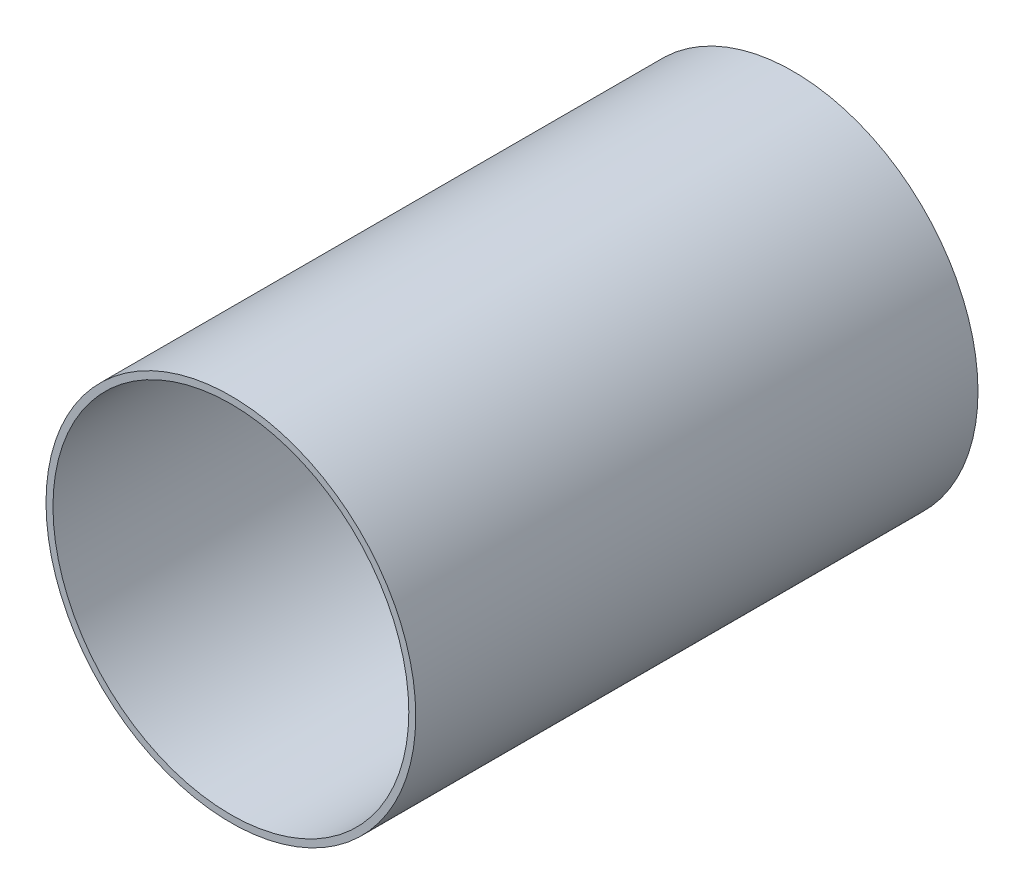
ISO-10303-21;
HEADER;
FILE_DESCRIPTION(('STEP AP214'),'2;1');
FILE_NAME('part.step','',(''),(''),'','','');
FILE_SCHEMA(('AUTOMOTIVE_DESIGN { 1 0 10303 214 1 1 1 1 }'));
ENDSEC;
DATA;
#1=APPLICATION_CONTEXT('core data for automotive mechanical design processes');
#2=APPLICATION_PROTOCOL_DEFINITION('international standard','automotive_design',2000,#1);
#3=PRODUCT_CONTEXT('',#1,'mechanical');
#4=PRODUCT('Part','Part','',(#3));
#5=PRODUCT_RELATED_PRODUCT_CATEGORY('part','',(#4));
#6=PRODUCT_DEFINITION_FORMATION('','',#4);
#7=PRODUCT_DEFINITION_CONTEXT('part definition',#1,'design');
#8=PRODUCT_DEFINITION('design','',#6,#7);
#9=PRODUCT_DEFINITION_SHAPE('','',#8);
#10=(LENGTH_UNIT() NAMED_UNIT(*) SI_UNIT(.MILLI.,.METRE.));
#11=(NAMED_UNIT(*) PLANE_ANGLE_UNIT() SI_UNIT($,.RADIAN.));
#12=(NAMED_UNIT(*) SI_UNIT($,.STERADIAN.) SOLID_ANGLE_UNIT());
#13=UNCERTAINTY_MEASURE_WITH_UNIT(LENGTH_MEASURE(1.E-05),#10,'distance_accuracy_value','');
#14=(GEOMETRIC_REPRESENTATION_CONTEXT(3) GLOBAL_UNCERTAINTY_ASSIGNED_CONTEXT((#13)) GLOBAL_UNIT_ASSIGNED_CONTEXT((#10,
#11,#12)) REPRESENTATION_CONTEXT('',''));
#15=CARTESIAN_POINT('',(0.,0.,0.));
#16=DIRECTION('',(0.,0.,1.));
#17=DIRECTION('',(1.,0.,0.));
#18=AXIS2_PLACEMENT_3D('',#15,#16,#17);
#19=CARTESIAN_POINT('',(0.,0.,150.495));
#20=DIRECTION('',(0.,0.,1.));
#21=DIRECTION('',(1.,0.,0.));
#22=AXIS2_PLACEMENT_3D('',#19,#20,#21);
#23=PLANE('',#22);
#24=CARTESIAN_POINT('',(0.,0.,150.495));
#25=DIRECTION('',(0.,0.,1.));
#26=DIRECTION('',(1.,0.,0.));
#27=AXIS2_PLACEMENT_3D('',#24,#25,#26);
#28=CIRCLE('',#27,49.48555);
#29=CARTESIAN_POINT('',(49.48555,0.,150.495));
#30=VERTEX_POINT('',#29);
#31=EDGE_CURVE('E10',#30,#30,#28,.T.);
#32=ORIENTED_EDGE('',*,*,#31,.T.);
#33=EDGE_LOOP('',(#32));
#34=FACE_BOUND('',#33,.T.);
#35=CARTESIAN_POINT('',(0.,0.,150.495));
#36=DIRECTION('',(0.,0.,1.));
#37=DIRECTION('',(1.,0.,0.));
#38=AXIS2_PLACEMENT_3D('',#35,#36,#37);
#39=CIRCLE('',#38,47.625);
#40=CARTESIAN_POINT('',(47.625,0.,150.495));
#41=VERTEX_POINT('',#40);
#42=EDGE_CURVE('E42',#41,#41,#39,.T.);
#43=ORIENTED_EDGE('',*,*,#42,.F.);
#44=EDGE_LOOP('',(#43));
#45=FACE_BOUND('',#44,.T.);
#46=ADVANCED_FACE('F31',(#34,#45),#23,.T.);
#47=CARTESIAN_POINT('',(0.,0.,0.));
#48=DIRECTION('',(0.,0.,1.));
#49=DIRECTION('',(1.,0.,0.));
#50=AXIS2_PLACEMENT_3D('',#47,#48,#49);
#51=PLANE('',#50);
#52=CARTESIAN_POINT('',(0.,0.,0.));
#53=DIRECTION('',(0.,0.,1.));
#54=DIRECTION('',(1.,0.,0.));
#55=AXIS2_PLACEMENT_3D('',#52,#53,#54);
#56=CIRCLE('',#55,49.48555);
#57=CARTESIAN_POINT('',(49.48555,0.,0.));
#58=VERTEX_POINT('',#57);
#59=EDGE_CURVE('E35',#58,#58,#56,.T.);
#60=ORIENTED_EDGE('',*,*,#59,.F.);
#61=EDGE_LOOP('',(#60));
#62=FACE_BOUND('',#61,.T.);
#63=CARTESIAN_POINT('',(0.,0.,0.));
#64=DIRECTION('',(0.,0.,1.));
#65=DIRECTION('',(1.,0.,0.));
#66=AXIS2_PLACEMENT_3D('',#63,#64,#65);
#67=CIRCLE('',#66,47.625);
#68=CARTESIAN_POINT('',(47.625,0.,0.));
#69=VERTEX_POINT('',#68);
#70=EDGE_CURVE('E44',#69,#69,#67,.T.);
#71=ORIENTED_EDGE('',*,*,#70,.T.);
#72=EDGE_LOOP('',(#71));
#73=FACE_BOUND('',#72,.T.);
#74=ADVANCED_FACE('F54',(#62,#73),#51,.F.);
#75=CARTESIAN_POINT('',(0.,0.,150.495));
#76=DIRECTION('',(0.,0.,-1.));
#77=DIRECTION('',(-1.,0.,0.));
#78=AXIS2_PLACEMENT_3D('',#75,#76,#77);
#79=CYLINDRICAL_SURFACE('',#78,49.48555);
#80=ORIENTED_EDGE('',*,*,#31,.F.);
#81=EDGE_LOOP('',(#80));
#82=FACE_BOUND('',#81,.T.);
#83=ORIENTED_EDGE('',*,*,#59,.T.);
#84=EDGE_LOOP('',(#83));
#85=FACE_BOUND('',#84,.T.);
#86=ADVANCED_FACE('F33',(#82,#85),#79,.T.);
#87=CARTESIAN_POINT('',(0.,0.,150.495));
#88=DIRECTION('',(0.,0.,-1.));
#89=DIRECTION('',(-1.,0.,0.));
#90=AXIS2_PLACEMENT_3D('',#87,#88,#89);
#91=CYLINDRICAL_SURFACE('',#90,47.625);
#92=ORIENTED_EDGE('',*,*,#42,.T.);
#93=EDGE_LOOP('',(#92));
#94=FACE_BOUND('',#93,.T.);
#95=ORIENTED_EDGE('',*,*,#70,.F.);
#96=EDGE_LOOP('',(#95));
#97=FACE_BOUND('',#96,.T.);
#98=ADVANCED_FACE('F50',(#94,#97),#91,.F.);
#99=CLOSED_SHELL('',(#46,#74,#86,#98));
#100=MANIFOLD_SOLID_BREP('B2',#99);
#101=ADVANCED_BREP_SHAPE_REPRESENTATION('',(#18,#100),#14);
#102=SHAPE_DEFINITION_REPRESENTATION(#9,#101);
ENDSEC;
END-ISO-10303-21;
